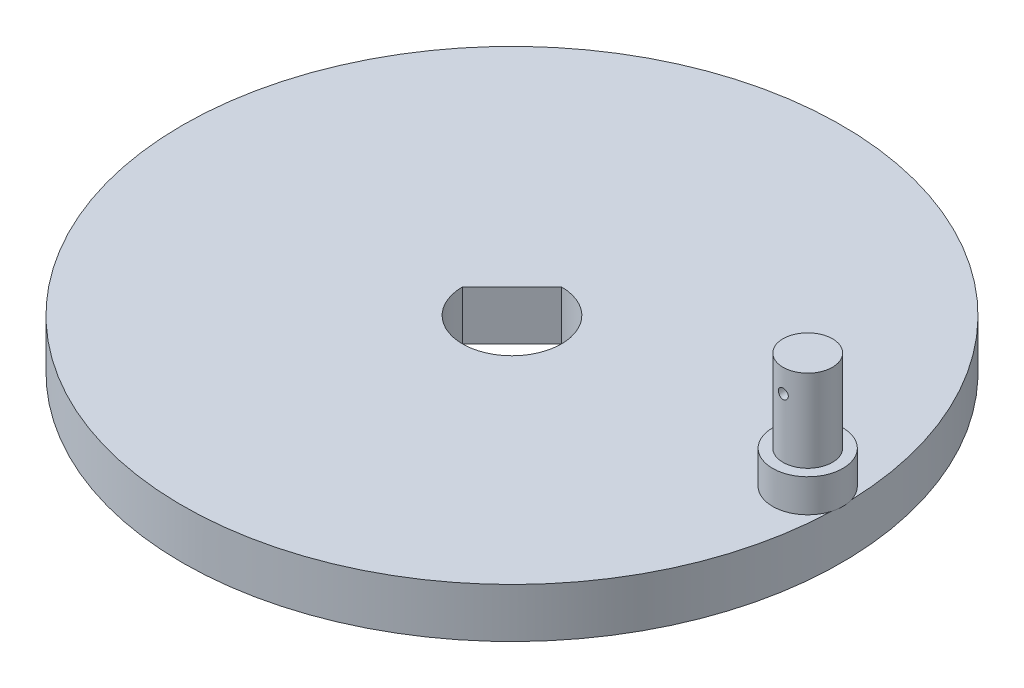
ISO-10303-21;
HEADER;
FILE_DESCRIPTION(('STEP AP214'),'2;1');
FILE_NAME('part.step','',(''),(''),'','','');
FILE_SCHEMA(('AUTOMOTIVE_DESIGN { 1 0 10303 214 1 1 1 1 }'));
ENDSEC;
DATA;
#1=APPLICATION_CONTEXT('core data for automotive mechanical design processes');
#2=APPLICATION_PROTOCOL_DEFINITION('international standard','automotive_design',2000,#1);
#3=PRODUCT_CONTEXT('',#1,'mechanical');
#4=PRODUCT('Part','Part','',(#3));
#5=PRODUCT_RELATED_PRODUCT_CATEGORY('part','',(#4));
#6=PRODUCT_DEFINITION_FORMATION('','',#4);
#7=PRODUCT_DEFINITION_CONTEXT('part definition',#1,'design');
#8=PRODUCT_DEFINITION('design','',#6,#7);
#9=PRODUCT_DEFINITION_SHAPE('','',#8);
#10=(LENGTH_UNIT() NAMED_UNIT(*) SI_UNIT(.MILLI.,.METRE.));
#11=(NAMED_UNIT(*) PLANE_ANGLE_UNIT() SI_UNIT($,.RADIAN.));
#12=(NAMED_UNIT(*) SI_UNIT($,.STERADIAN.) SOLID_ANGLE_UNIT());
#13=UNCERTAINTY_MEASURE_WITH_UNIT(LENGTH_MEASURE(1.E-05),#10,'distance_accuracy_value','');
#14=(GEOMETRIC_REPRESENTATION_CONTEXT(3) GLOBAL_UNCERTAINTY_ASSIGNED_CONTEXT((#13)) GLOBAL_UNIT_ASSIGNED_CONTEXT((#10,
#11,#12)) REPRESENTATION_CONTEXT('',''));
#15=CARTESIAN_POINT('',(0.,0.,0.));
#16=DIRECTION('',(0.,0.,1.));
#17=DIRECTION('',(1.,0.,0.));
#18=AXIS2_PLACEMENT_3D('',#15,#16,#17);
#19=CARTESIAN_POINT('',(17.9492642838594,3.,0.));
#20=DIRECTION('',(0.,1.,0.));
#21=DIRECTION('',(0.,0.,1.));
#22=AXIS2_PLACEMENT_3D('',#19,#20,#21);
#23=CYLINDRICAL_SURFACE('',#22,1.5);
#24=CARTESIAN_POINT('',(17.9492642838594,5.,0.));
#25=DIRECTION('',(0.,1.,0.));
#26=DIRECTION('',(0.,0.,1.));
#27=AXIS2_PLACEMENT_3D('',#24,#25,#26);
#28=CIRCLE('',#27,1.5);
#29=CARTESIAN_POINT('',(17.9492642838594,5.,1.5));
#30=VERTEX_POINT('',#29);
#31=EDGE_CURVE('E11',#30,#30,#28,.F.);
#32=ORIENTED_EDGE('',*,*,#31,.F.);
#33=EDGE_LOOP('',(#32));
#34=FACE_BOUND('',#33,.T.);
#35=CARTESIAN_POINT('',(17.6395481325297,8.60545747660254,-1.4676770440412));
#36=CARTESIAN_POINT('',(17.6395487506244,8.58878430651743,-1.46767738053155));
#37=CARTESIAN_POINT('',(17.640941338725,8.57210337887769,-1.46797317154164));
#38=CARTESIAN_POINT('',(17.6464698908307,8.53921385964607,-1.4691232860796));
#39=CARTESIAN_POINT('',(17.650608050548,8.52300565694523,-1.46997805663155));
#40=CARTESIAN_POINT('',(17.6614932207786,8.49154258429853,-1.47214754002417));
#41=CARTESIAN_POINT('',(17.6682375358002,8.47628674821459,-1.47346177751449));
#42=CARTESIAN_POINT('',(17.6841357328591,8.44712374460774,-1.47640506513733));
#43=CARTESIAN_POINT('',(17.6932894910187,8.43321650779903,-1.47803409908393));
#44=CARTESIAN_POINT('',(17.7138925109142,8.40693617743137,-1.48145547916451));
#45=CARTESIAN_POINT('',(17.7253709987665,8.39458624096613,-1.48324972759019));
#46=CARTESIAN_POINT('',(17.7502341169936,8.37197283056655,-1.4867899613466));
#47=CARTESIAN_POINT('',(17.7636188938038,8.36170951706741,-1.48853594295729));
#48=CARTESIAN_POINT('',(17.7920773721909,8.34346382762365,-1.49181068559484));
#49=CARTESIAN_POINT('',(17.8071664500924,8.33550498272896,-1.49333713070411));
#50=CARTESIAN_POINT('',(17.8385033943645,8.32224453278814,-1.49598762017045));
#51=CARTESIAN_POINT('',(17.8547511547361,8.31694268502902,-1.49711170128024));
#52=CARTESIAN_POINT('',(17.8877209010483,8.30921548338759,-1.49882661829657));
#53=CARTESIAN_POINT('',(17.9044339736478,8.30675362334849,-1.49942419784711));
#54=CARTESIAN_POINT('',(17.9380461797661,8.30466420105591,-1.50005218567087));
#55=CARTESIAN_POINT('',(17.9549452941144,8.30503634945507,-1.50008265184428));
#56=CARTESIAN_POINT('',(17.9881789898508,8.3085765191348,-1.49958587669037));
#57=CARTESIAN_POINT('',(18.0045182453911,8.31170208655548,-1.49906707981472));
#58=CARTESIAN_POINT('',(18.0364374391473,8.32059476532646,-1.4975500990119));
#59=CARTESIAN_POINT('',(18.0520173516567,8.32636196603696,-1.49655189886761));
#60=CARTESIAN_POINT('',(18.0820707397633,8.34040367109394,-1.49418575586873));
#61=CARTESIAN_POINT('',(18.0965380396589,8.34869105930467,-1.49281591707459));
#62=CARTESIAN_POINT('',(18.1238920537478,8.36752847932991,-1.48986398661882));
#63=CARTESIAN_POINT('',(18.1367785912917,8.37807876366031,-1.48828187127669));
#64=CARTESIAN_POINT('',(18.1608368218225,8.4013559653999,-1.48505459496706));
#65=CARTESIAN_POINT('',(18.1719754511066,8.41411699438986,-1.48340881866329));
#66=CARTESIAN_POINT('',(18.1919610197893,8.44134025392906,-1.4802705641026));
#67=CARTESIAN_POINT('',(18.2008079074643,8.45580252286378,-1.47877808930608));
#68=CARTESIAN_POINT('',(18.2159772783389,8.48607708324418,-1.47611786148325));
#69=CARTESIAN_POINT('',(18.2222924435229,8.50189313018123,-1.4749510527152));
#70=CARTESIAN_POINT('',(18.2321665453802,8.53438950177218,-1.47308920606806));
#71=CARTESIAN_POINT('',(18.2357258178978,8.5510697208501,-1.47239411070531));
#72=CARTESIAN_POINT('',(18.2399398570067,8.58453596173082,-1.47156797445933));
#73=CARTESIAN_POINT('',(18.2406400520552,8.60131605087343,-1.47142811236741));
#74=CARTESIAN_POINT('',(18.2392384032402,8.63475340637324,-1.47170496466146));
#75=CARTESIAN_POINT('',(18.2371367100638,8.65141067928712,-1.47212164911606));
#76=CARTESIAN_POINT('',(18.2302308675944,8.68397312881825,-1.4734550661503));
#77=CARTESIAN_POINT('',(18.2254516105339,8.69988379070014,-1.47436719047823));
#78=CARTESIAN_POINT('',(18.2133527758486,8.73067869037469,-1.47658215508463));
#79=CARTESIAN_POINT('',(18.2060329957906,8.74556284626026,-1.47788502649737));
#80=CARTESIAN_POINT('',(18.1889557449793,8.77408476183796,-1.48075102766327));
#81=CARTESIAN_POINT('',(18.1791692607099,8.78770484086809,-1.48231717536228));
#82=CARTESIAN_POINT('',(18.1574745024528,8.81312646520792,-1.48551959164122));
#83=CARTESIAN_POINT('',(18.1455660240079,8.82492783507784,-1.48715586696649));
#84=CARTESIAN_POINT('',(18.1197618828457,8.84654795761049,-1.49033607577284));
#85=CARTESIAN_POINT('',(18.1058403926844,8.85633616250582,-1.49187836716429));
#86=CARTESIAN_POINT('',(18.0765232129081,8.8734346680432,-1.49466439519306));
#87=CARTESIAN_POINT('',(18.061127592571,8.88074508505739,-1.49590814585088));
#88=CARTESIAN_POINT('',(18.0293965147513,8.89262924465087,-1.49794183799974));
#89=CARTESIAN_POINT('',(18.0130676350919,8.89722004487666,-1.49873460680949));
#90=CARTESIAN_POINT('',(17.979854320666,8.90359168594464,-1.49978000685703));
#91=CARTESIAN_POINT('',(17.9629699513216,8.90537285648666,-1.5000327014718));
#92=CARTESIAN_POINT('',(17.929430256356,8.90606352390164,-1.49996105215401));
#93=CARTESIAN_POINT('',(17.912775877959,8.90502100808307,-1.49964638087174));
#94=CARTESIAN_POINT('',(17.8798873437291,8.90020165906571,-1.49848512533673));
#95=CARTESIAN_POINT('',(17.8636531852422,8.89642484314122,-1.49763854444441));
#96=CARTESIAN_POINT('',(17.832077134657,8.88626135955746,-1.49549908528359));
#97=CARTESIAN_POINT('',(17.8167342315788,8.87987771765439,-1.49420672470305));
#98=CARTESIAN_POINT('',(17.7873311434167,8.86468828147744,-1.49130687068659));
#99=CARTESIAN_POINT('',(17.7732710665,8.85588228320258,-1.4896993507125));
#100=CARTESIAN_POINT('',(17.7465764635216,8.83592309479432,-1.48630480430847));
#101=CARTESIAN_POINT('',(17.7339700098249,8.82473279010133,-1.48451520565835));
#102=CARTESIAN_POINT('',(17.7107974454999,8.80039873862725,-1.48096972147372));
#103=CARTESIAN_POINT('',(17.7002318190359,8.78725452960902,-1.47921384402796));
#104=CARTESIAN_POINT('',(17.6813361677702,8.75921935103627,-1.47590912692308));
#105=CARTESIAN_POINT('',(17.6730307197157,8.74431152672123,-1.47436264859988));
#106=CARTESIAN_POINT('',(17.6590569469953,8.71328331450961,-1.47167616767512));
#107=CARTESIAN_POINT('',(17.6533862022063,8.69716405526214,-1.47053579227099));
#108=CARTESIAN_POINT('',(17.6459479010282,8.66841573766047,-1.46901645997831));
#109=CARTESIAN_POINT('',(17.6435523163283,8.65595173227446,-1.468517235703));
#110=CARTESIAN_POINT('',(17.6403522262163,8.63081246712356,-1.46784740580955));
#111=CARTESIAN_POINT('',(17.6395476624763,8.61813721512031,-1.46767678814447));
#112=CARTESIAN_POINT('',(17.6395481325297,8.60545747660254,-1.4676770440412));
#113=B_SPLINE_CURVE_WITH_KNOTS('',3,(#35,#36,#37,#38,#39,#40,#41,#42,#43,#44,#45,#46,#47,#48,
#49,#50,#51,#52,#53,#54,#55,#56,#57,#58,#59,#60,#61,#62,#63,#64,#65,#66,#67,#68,#69,#70,#71,#72,
#73,#74,#75,#76,#77,#78,#79,#80,#81,#82,#83,#84,#85,#86,#87,#88,#89,#90,#91,#92,#93,#94,#95,#96,
#97,#98,#99,#100,#101,#102,#103,#104,#105,#106,#107,#108,#109,#110,#111,#112),.UNSPECIFIED.,.T.,
.F.,(4,2,2,2,2,2,2,2,2,2,2,2,2,2,2,2,2,2,2,2,2,2,2,2,2,2,2,2,2,2,2,2,2,2,2,2,2,2,4),(0.,
0.0499730408230488,0.0999860947682967,0.149947559121185,0.199906455286095,0.250537482206086,
0.301172400548008,0.352307460178397,0.403437847840428,0.453903395795121,0.504363791373794,
0.554059514778879,0.603756919396832,0.653712787689621,0.703674233445479,0.754489364128346,
0.805305641584862,0.856267763804227,0.90722367459197,0.95736670942127,1.00750704763953,
1.05718880665035,1.10687452529855,1.15717440124104,1.2074791262727,1.258498503401,
1.30951548401359,1.36020899811386,1.41089656307223,1.46072814381047,1.51055940973395,
1.56033299991339,1.61011078310565,1.66072889038224,1.71135899154964,1.76251943271918,
1.81363278678309,1.85163805623574,1.88964193236366),.UNSPECIFIED.);
#114=CARTESIAN_POINT('',(17.6395481325297,8.60545747660254,-1.4676770440412));
#115=VERTEX_POINT('',#114);
#116=EDGE_CURVE('E94',#115,#115,#113,.T.);
#117=ORIENTED_EDGE('',*,*,#116,.T.);
#118=EDGE_LOOP('',(#117));
#119=FACE_BOUND('',#118,.T.);
#120=CARTESIAN_POINT('',(17.9492642838594,10.,0.));
#121=DIRECTION('',(0.,1.,0.));
#122=DIRECTION('',(0.,0.,1.));
#123=AXIS2_PLACEMENT_3D('',#120,#121,#122);
#124=CIRCLE('',#123,1.5);
#125=CARTESIAN_POINT('',(17.9492642838594,10.,1.5));
#126=VERTEX_POINT('',#125);
#127=EDGE_CURVE('E95',#126,#126,#124,.T.);
#128=ORIENTED_EDGE('',*,*,#127,.F.);
#129=EDGE_LOOP('',(#128));
#130=FACE_BOUND('',#129,.T.);
#131=CARTESIAN_POINT('',(17.9492642838594,8.3052769859961,1.5));
#132=CARTESIAN_POINT('',(17.9325907814154,8.30475609426014,1.49999968920017));
#133=CARTESIAN_POINT('',(17.9158660097458,8.30562761564944,1.49971913397626));
#134=CARTESIAN_POINT('',(17.8828020822998,8.31013063502305,1.49861838644105));
#135=CARTESIAN_POINT('',(17.8664632378645,8.31376428784048,1.49779777287891));
#136=CARTESIAN_POINT('',(17.8346556808013,8.32367307185736,1.49570008590104));
#137=CARTESIAN_POINT('',(17.8191861611934,8.32994570583513,1.4944234441887));
#138=CARTESIAN_POINT('',(17.7895227685167,8.34494481021791,1.49154450229047));
#139=CARTESIAN_POINT('',(17.7753288247575,8.35367114453189,1.48994222016713));
#140=CARTESIAN_POINT('',(17.7484242045759,8.37345509979791,1.48655628123278));
#141=CARTESIAN_POINT('',(17.7357337302699,8.38453985624167,1.48477065062977));
#142=CARTESIAN_POINT('',(17.7123780647157,8.4086746646491,1.4812240781298));
#143=CARTESIAN_POINT('',(17.7017130555452,8.42172489310836,1.47946313846557));
#144=CARTESIAN_POINT('',(17.6826000466448,8.44959118495054,1.47613874137387));
#145=CARTESIAN_POINT('',(17.6741768843255,8.46442458439483,1.47457758845917));
#146=CARTESIAN_POINT('',(17.6599498773537,8.49533248441376,1.47185255693115));
#147=CARTESIAN_POINT('',(17.6541457870855,8.51140686844357,1.47068864106755));
#148=CARTESIAN_POINT('',(17.6453956419332,8.54412789366296,1.46890561771386));
#149=CARTESIAN_POINT('',(17.6424145596796,8.56076479492947,1.46827984228672));
#150=CARTESIAN_POINT('',(17.6392826018305,8.5943136466836,1.46762189607411));
#151=CARTESIAN_POINT('',(17.6391313877704,8.61122556403592,1.46758965429941));
#152=CARTESIAN_POINT('',(17.6416412828544,8.64453527013469,1.46811769771892));
#153=CARTESIAN_POINT('',(17.6442540091485,8.66093689732449,1.46866778926809));
#154=CARTESIAN_POINT('',(17.6521335611138,8.693062694152,1.47028206054866));
#155=CARTESIAN_POINT('',(17.6574004816746,8.70878683954741,1.47134625865969));
#156=CARTESIAN_POINT('',(17.6704609155143,8.73920187289377,1.47387681931106));
#157=CARTESIAN_POINT('',(17.6782664236824,8.75388744437947,1.47534508591598));
#158=CARTESIAN_POINT('',(17.6961747831699,8.7817552284565,1.47852228386802));
#159=CARTESIAN_POINT('',(17.7062779119784,8.79493725917271,1.4802312442748));
#160=CARTESIAN_POINT('',(17.7287265126075,8.81969373790549,1.48374335147589));
#161=CARTESIAN_POINT('',(17.7411116522795,8.83123207334054,1.48554768183142));
#162=CARTESIAN_POINT('',(17.7676535334149,8.85207631746547,1.48902531375792));
#163=CARTESIAN_POINT('',(17.7818103390055,8.861382145312,1.49069861058245));
#164=CARTESIAN_POINT('',(17.811584534633,8.87753487343616,1.49374328548197));
#165=CARTESIAN_POINT('',(17.8272086439596,8.88436968976082,1.49511316747148));
#166=CARTESIAN_POINT('',(17.8594174369657,8.89530596959775,1.49739369738556));
#167=CARTESIAN_POINT('',(17.8760020088587,8.89940775051143,1.49830439863416));
#168=CARTESIAN_POINT('',(17.9093770703505,8.90470190686059,1.49956105320252));
#169=CARTESIAN_POINT('',(17.9261600003312,8.90593985541286,1.49991582336267));
#170=CARTESIAN_POINT('',(17.9596988465163,8.90559860984843,1.50005742288163));
#171=CARTESIAN_POINT('',(17.9764547646546,8.90401962727238,1.49984429488681));
#172=CARTESIAN_POINT('',(18.0092569266821,8.89812983591901,1.49888862689915));
#173=CARTESIAN_POINT('',(18.0253092254092,8.89385160423132,1.49815238712878));
#174=CARTESIAN_POINT('',(18.0564682463323,8.8827232721189,1.49624568915356));
#175=CARTESIAN_POINT('',(18.0715749126603,8.87587301990611,1.49507520532182));
#176=CARTESIAN_POINT('',(18.1005759276377,8.85972104736401,1.49242054798507));
#177=CARTESIAN_POINT('',(18.1144572515209,8.85039643308392,1.49093347203864));
#178=CARTESIAN_POINT('',(18.1404755982293,8.82958606966504,1.48782062789875));
#179=CARTESIAN_POINT('',(18.1526124297543,8.81810008382975,1.4861948445258));
#180=CARTESIAN_POINT('',(18.1749991296936,8.79307322597393,1.48296123558221));
#181=CARTESIAN_POINT('',(18.18521549897,8.77950226751251,1.4813541197196));
#182=CARTESIAN_POINT('',(18.2032275989319,8.75081539635879,1.47837285304679));
#183=CARTESIAN_POINT('',(18.2110233701596,8.73569950954788,1.47699869833492));
#184=CARTESIAN_POINT('',(18.2239496609723,8.70437526602708,1.47464954234836));
#185=CARTESIAN_POINT('',(18.2290857804937,8.68816928654198,1.47367370333957));
#186=CARTESIAN_POINT('',(18.236555505602,8.65510234038496,1.4722358617052));
#187=CARTESIAN_POINT('',(18.2388894611718,8.63824145578059,1.47177379491134));
#188=CARTESIAN_POINT('',(18.240664159781,8.60465177655221,1.47142342720134));
#189=CARTESIAN_POINT('',(18.2401536172785,8.58792564132604,1.47152546527344));
#190=CARTESIAN_POINT('',(18.2363688618886,8.55480196379937,1.47226852192473));
#191=CARTESIAN_POINT('',(18.2330947081496,8.53840441447398,1.4729095289686));
#192=CARTESIAN_POINT('',(18.2239064137398,8.50647433412203,1.47465020897422));
#193=CARTESIAN_POINT('',(18.218004265349,8.49093823019573,1.47574779694932));
#194=CARTESIAN_POINT('',(18.2037370990493,8.46107099519916,1.47827460813115));
#195=CARTESIAN_POINT('',(18.195371898057,8.44673995380541,1.47970385598915));
#196=CARTESIAN_POINT('',(18.1762661731506,8.41945348870403,1.48275583327294));
#197=CARTESIAN_POINT('',(18.1654914916411,8.40652227294759,1.48438117237115));
#198=CARTESIAN_POINT('',(18.1419336766594,8.38263377431219,1.48762212000444));
#199=CARTESIAN_POINT('',(18.1291500739564,8.37167695388626,1.4892377261744));
#200=CARTESIAN_POINT('',(18.1017662843168,8.35193037405241,1.49229181007432));
#201=CARTESIAN_POINT('',(18.0871473904476,8.3431662046169,1.49372810621425));
#202=CARTESIAN_POINT('',(18.0566212757946,8.32822998526938,1.49623130753566));
#203=CARTESIAN_POINT('',(18.0407152150764,8.32205563163766,1.49729854086069));
#204=CARTESIAN_POINT('',(18.0122032413176,8.31369225295119,1.49872890088257));
#205=CARTESIAN_POINT('',(17.9997788640263,8.31089045573974,1.4992017965282));
#206=CARTESIAN_POINT('',(17.9746676876473,8.30688148597147,1.49983745958672));
#207=CARTESIAN_POINT('',(17.9619808970707,8.30567426177865,1.50000023704205));
#208=CARTESIAN_POINT('',(17.9492642838594,8.3052769859961,1.5));
#209=B_SPLINE_CURVE_WITH_KNOTS('',3,(#131,#132,#133,#134,#135,#136,#137,#138,#139,#140,#141,
#142,#143,#144,#145,#146,#147,#148,#149,#150,#151,#152,#153,#154,#155,#156,#157,#158,#159,#160,
#161,#162,#163,#164,#165,#166,#167,#168,#169,#170,#171,#172,#173,#174,#175,#176,#177,#178,#179,
#180,#181,#182,#183,#184,#185,#186,#187,#188,#189,#190,#191,#192,#193,#194,#195,#196,#197,#198,
#199,#200,#201,#202,#203,#204,#205,#206,#207,#208),.UNSPECIFIED.,.T.,.F.,(4,2,2,2,2,2,2,2,2,2,2,
2,2,2,2,2,2,2,2,2,2,2,2,2,2,2,2,2,2,2,2,2,2,2,2,2,2,2,4),(0.,0.0499984148056362,
0.100035875165158,0.150026092075619,0.200013536895971,0.250610654453315,0.30121231824623,
0.352353233581577,0.403489351939256,0.45398233218605,0.504469273210761,0.554086838395352,
0.603706177570557,0.653563460998922,0.703426769008474,0.754256584767011,0.805088240892453,
0.856165219230649,0.907236264703455,0.957488837219017,1.00773763611954,1.05739129115107,
1.10704787695871,1.15718097712328,1.20731957067122,1.25826480217684,1.30920918036302,
1.36004585373736,1.41087617708291,1.46083869312541,1.51080013986933,1.56053589849046,
1.6102753550023,1.66077050848221,1.7112774738668,1.76234895449418,1.81337490864951,
1.85150913357349,1.88964212359164),.UNSPECIFIED.);
#210=CARTESIAN_POINT('',(17.9492642838594,8.3052769859961,1.5));
#211=VERTEX_POINT('',#210);
#212=EDGE_CURVE('E99',#211,#211,#209,.T.);
#213=ORIENTED_EDGE('',*,*,#212,.T.);
#214=EDGE_LOOP('',(#213));
#215=FACE_BOUND('',#214,.T.);
#216=ADVANCED_FACE('F33',(#34,#119,#130,#215),#23,.T.);
#217=CARTESIAN_POINT('',(17.9492642838594,10.,0.));
#218=DIRECTION('',(0.,1.,0.));
#219=DIRECTION('',(0.,0.,1.));
#220=AXIS2_PLACEMENT_3D('',#217,#218,#219);
#221=PLANE('',#220);
#222=ORIENTED_EDGE('',*,*,#127,.T.);
#223=EDGE_LOOP('',(#222));
#224=FACE_BOUND('',#223,.T.);
#225=ADVANCED_FACE('F121',(#224),#221,.T.);
#226=CARTESIAN_POINT('',(17.9398754169424,8.60545747660254,8.));
#227=DIRECTION('',(0.,0.,-1.));
#228=DIRECTION('',(-1.,0.,0.));
#229=AXIS2_PLACEMENT_3D('',#226,#227,#228);
#230=CYLINDRICAL_SURFACE('',#229,0.300327284412701);
#231=ORIENTED_EDGE('',*,*,#212,.F.);
#232=EDGE_LOOP('',(#231));
#233=FACE_BOUND('',#232,.T.);
#234=ORIENTED_EDGE('',*,*,#116,.F.);
#235=EDGE_LOOP('',(#234));
#236=FACE_BOUND('',#235,.T.);
#237=ADVANCED_FACE('F117',(#233,#236),#230,.F.);
#238=CARTESIAN_POINT('',(17.9492642838594,5.,0.));
#239=DIRECTION('',(0.,-1.,0.));
#240=DIRECTION('',(0.,0.,-1.));
#241=AXIS2_PLACEMENT_3D('',#238,#239,#240);
#242=CYLINDRICAL_SURFACE('',#241,2.13043050935033);
#243=CARTESIAN_POINT('',(17.9492642838594,5.,0.));
#244=DIRECTION('',(0.,1.,0.));
#245=DIRECTION('',(0.,0.,1.));
#246=AXIS2_PLACEMENT_3D('',#243,#244,#245);
#247=CIRCLE('',#246,2.13043050935033);
#248=CARTESIAN_POINT('',(17.9492642838594,5.,2.13043050935033));
#249=VERTEX_POINT('',#248);
#250=EDGE_CURVE('E82',#249,#249,#247,.T.);
#251=ORIENTED_EDGE('',*,*,#250,.F.);
#252=EDGE_LOOP('',(#251));
#253=FACE_BOUND('',#252,.T.);
#254=CARTESIAN_POINT('',(17.9492642838594,3.,0.));
#255=DIRECTION('',(0.,1.,0.));
#256=DIRECTION('',(0.,0.,1.));
#257=AXIS2_PLACEMENT_3D('',#254,#255,#256);
#258=CIRCLE('',#257,2.13043050935033);
#259=CARTESIAN_POINT('',(19.9907178040156,3.,0.609263227359278));
#260=VERTEX_POINT('',#259);
#261=CARTESIAN_POINT('',(19.9907178040156,3.,-0.609263227359278));
#262=VERTEX_POINT('',#261);
#263=EDGE_CURVE('E77',#260,#262,#258,.T.);
#264=ORIENTED_EDGE('',*,*,#263,.T.);
#265=EDGE_CURVE('E71',#262,#260,#258,.T.);
#266=ORIENTED_EDGE('',*,*,#265,.T.);
#267=EDGE_LOOP('',(#264,#266));
#268=FACE_BOUND('',#267,.T.);
#269=ADVANCED_FACE('F81',(#253,#268),#242,.T.);
#270=CARTESIAN_POINT('',(17.9492642838594,5.,0.));
#271=DIRECTION('',(0.,1.,0.));
#272=DIRECTION('',(0.,0.,1.));
#273=AXIS2_PLACEMENT_3D('',#270,#271,#272);
#274=PLANE('',#273);
#275=ORIENTED_EDGE('',*,*,#31,.T.);
#276=EDGE_LOOP('',(#275));
#277=FACE_BOUND('',#276,.T.);
#278=ORIENTED_EDGE('',*,*,#250,.T.);
#279=EDGE_LOOP('',(#278));
#280=FACE_BOUND('',#279,.T.);
#281=ADVANCED_FACE('F144',(#277,#280),#274,.T.);
#282=CARTESIAN_POINT('',(17.9492642838594,3.,0.));
#283=DIRECTION('',(0.,1.,0.));
#284=DIRECTION('',(0.,0.,1.));
#285=AXIS2_PLACEMENT_3D('',#282,#283,#284);
#286=PLANE('',#285);
#287=ORIENTED_EDGE('',*,*,#263,.F.);
#288=CARTESIAN_POINT('',(0.,3.,0.));
#289=DIRECTION('',(0.,1.,0.));
#290=DIRECTION('',(0.,0.,1.));
#291=AXIS2_PLACEMENT_3D('',#288,#289,#290);
#292=CIRCLE('',#291,20.);
#293=EDGE_CURVE('E41',#260,#262,#292,.T.);
#294=ORIENTED_EDGE('',*,*,#293,.T.);
#295=EDGE_LOOP('',(#287,#294));
#296=FACE_BOUND('',#295,.T.);
#297=ADVANCED_FACE('F80',(#296),#286,.F.);
#298=CARTESIAN_POINT('',(-3.,3.,0.));
#299=DIRECTION('',(-0.707106781186548,0.,-0.707106781186548));
#300=DIRECTION('',(-0.707106781186548,0.,0.707106781186548));
#301=AXIS2_PLACEMENT_3D('',#298,#299,#300);
#302=PLANE('',#301);
#303=DIRECTION('',(0.707106781186548,0.,-0.707106781186548));
#304=VECTOR('',#303,1.);
#305=CARTESIAN_POINT('',(-3.,0.,0.));
#306=LINE('',#305,#304);
#307=CARTESIAN_POINT('',(-3.,0.,0.));
#308=VERTEX_POINT('',#307);
#309=CARTESIAN_POINT('',(0.,0.,-3.));
#310=VERTEX_POINT('',#309);
#311=EDGE_CURVE('E84',#308,#310,#306,.T.);
#312=ORIENTED_EDGE('',*,*,#311,.T.);
#313=DIRECTION('',(0.,-1.,0.));
#314=VECTOR('',#313,1.);
#315=CARTESIAN_POINT('',(0.,3.,-3.));
#316=LINE('',#315,#314);
#317=CARTESIAN_POINT('',(0.,3.,-3.));
#318=VERTEX_POINT('',#317);
#319=EDGE_CURVE('E89',#318,#310,#316,.T.);
#320=ORIENTED_EDGE('',*,*,#319,.F.);
#321=DIRECTION('',(0.707106781186548,0.,-0.707106781186548));
#322=VECTOR('',#321,1.);
#323=CARTESIAN_POINT('',(-3.,3.,0.));
#324=LINE('',#323,#322);
#325=CARTESIAN_POINT('',(-3.,3.,0.));
#326=VERTEX_POINT('',#325);
#327=EDGE_CURVE('E87',#326,#318,#324,.T.);
#328=ORIENTED_EDGE('',*,*,#327,.F.);
#329=DIRECTION('',(0.,-1.,0.));
#330=VECTOR('',#329,1.);
#331=CARTESIAN_POINT('',(-3.,3.,0.));
#332=LINE('',#331,#330);
#333=EDGE_CURVE('E55',#326,#308,#332,.T.);
#334=ORIENTED_EDGE('',*,*,#333,.T.);
#335=EDGE_LOOP('',(#312,#320,#328,#334));
#336=FACE_BOUND('',#335,.T.);
#337=ADVANCED_FACE('F123',(#336),#302,.F.);
#338=CARTESIAN_POINT('',(0.,3.,0.));
#339=DIRECTION('',(0.,-1.,0.));
#340=DIRECTION('',(0.,0.,-1.));
#341=AXIS2_PLACEMENT_3D('',#338,#339,#340);
#342=CYLINDRICAL_SURFACE('',#341,3.);
#343=CARTESIAN_POINT('',(0.,3.,0.));
#344=DIRECTION('',(0.,1.,0.));
#345=DIRECTION('',(0.,0.,1.));
#346=AXIS2_PLACEMENT_3D('',#343,#344,#345);
#347=CIRCLE('',#346,3.);
#348=EDGE_CURVE('E100',#326,#318,#347,.T.);
#349=ORIENTED_EDGE('',*,*,#348,.T.);
#350=ORIENTED_EDGE('',*,*,#319,.T.);
#351=CARTESIAN_POINT('',(0.,0.,0.));
#352=DIRECTION('',(0.,1.,0.));
#353=DIRECTION('',(0.,0.,1.));
#354=AXIS2_PLACEMENT_3D('',#351,#352,#353);
#355=CIRCLE('',#354,3.);
#356=EDGE_CURVE('E98',#308,#310,#355,.T.);
#357=ORIENTED_EDGE('',*,*,#356,.F.);
#358=ORIENTED_EDGE('',*,*,#333,.F.);
#359=EDGE_LOOP('',(#349,#350,#357,#358));
#360=FACE_BOUND('',#359,.T.);
#361=ADVANCED_FACE('F158',(#360),#342,.F.);
#362=CARTESIAN_POINT('',(0.,0.,0.));
#363=DIRECTION('',(0.,1.,0.));
#364=DIRECTION('',(0.,0.,1.));
#365=AXIS2_PLACEMENT_3D('',#362,#363,#364);
#366=PLANE('',#365);
#367=CARTESIAN_POINT('',(0.,0.,0.));
#368=DIRECTION('',(0.,1.,0.));
#369=DIRECTION('',(0.,0.,1.));
#370=AXIS2_PLACEMENT_3D('',#367,#368,#369);
#371=CIRCLE('',#370,20.);
#372=CARTESIAN_POINT('',(0.,0.,20.));
#373=VERTEX_POINT('',#372);
#374=EDGE_CURVE('E69',#373,#373,#371,.T.);
#375=ORIENTED_EDGE('',*,*,#374,.F.);
#376=EDGE_LOOP('',(#375));
#377=FACE_BOUND('',#376,.T.);
#378=ORIENTED_EDGE('',*,*,#356,.T.);
#379=ORIENTED_EDGE('',*,*,#311,.F.);
#380=EDGE_LOOP('',(#378,#379));
#381=FACE_BOUND('',#380,.T.);
#382=ADVANCED_FACE('F162',(#377,#381),#366,.F.);
#383=CARTESIAN_POINT('',(0.,3.,0.));
#384=DIRECTION('',(0.,-1.,0.));
#385=DIRECTION('',(0.,0.,-1.));
#386=AXIS2_PLACEMENT_3D('',#383,#384,#385);
#387=CYLINDRICAL_SURFACE('',#386,20.);
#388=ORIENTED_EDGE('',*,*,#293,.F.);
#389=EDGE_CURVE('E47',#262,#260,#292,.T.);
#390=ORIENTED_EDGE('',*,*,#389,.F.);
#391=EDGE_LOOP('',(#388,#390));
#392=FACE_BOUND('',#391,.T.);
#393=ORIENTED_EDGE('',*,*,#374,.T.);
#394=EDGE_LOOP('',(#393));
#395=FACE_BOUND('',#394,.T.);
#396=ADVANCED_FACE('F35',(#392,#395),#387,.T.);
#397=CARTESIAN_POINT('',(0.,3.,0.));
#398=DIRECTION('',(0.,1.,0.));
#399=DIRECTION('',(0.,0.,1.));
#400=AXIS2_PLACEMENT_3D('',#397,#398,#399);
#401=PLANE('',#400);
#402=ORIENTED_EDGE('',*,*,#389,.T.);
#403=ORIENTED_EDGE('',*,*,#265,.F.);
#404=EDGE_LOOP('',(#402,#403));
#405=FACE_BOUND('',#404,.T.);
#406=ORIENTED_EDGE('',*,*,#348,.F.);
#407=ORIENTED_EDGE('',*,*,#327,.T.);
#408=EDGE_LOOP('',(#406,#407));
#409=FACE_BOUND('',#408,.T.);
#410=ADVANCED_FACE('F72',(#405,#409),#401,.T.);
#411=CLOSED_SHELL('',(#216,#225,#237,#269,#281,#297,#337,#361,#382,#396,#410));
#412=MANIFOLD_SOLID_BREP('B2',#411);
#413=ADVANCED_BREP_SHAPE_REPRESENTATION('',(#18,#412),#14);
#414=SHAPE_DEFINITION_REPRESENTATION(#9,#413);
ENDSEC;
END-ISO-10303-21;
